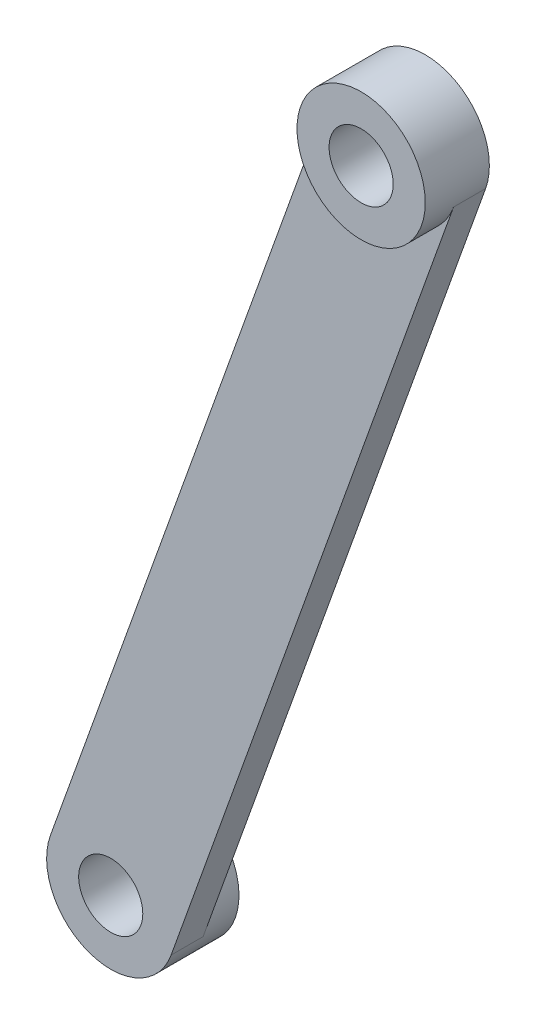
ISO-10303-21;
HEADER;
FILE_DESCRIPTION(('STEP AP214'),'2;1');
FILE_NAME('part.step','',(''),(''),'','','');
FILE_SCHEMA(('AUTOMOTIVE_DESIGN { 1 0 10303 214 1 1 1 1 }'));
ENDSEC;
DATA;
#1=APPLICATION_CONTEXT('core data for automotive mechanical design processes');
#2=APPLICATION_PROTOCOL_DEFINITION('international standard','automotive_design',2000,#1);
#3=PRODUCT_CONTEXT('',#1,'mechanical');
#4=PRODUCT('Part','Part','',(#3));
#5=PRODUCT_RELATED_PRODUCT_CATEGORY('part','',(#4));
#6=PRODUCT_DEFINITION_FORMATION('','',#4);
#7=PRODUCT_DEFINITION_CONTEXT('part definition',#1,'design');
#8=PRODUCT_DEFINITION('design','',#6,#7);
#9=PRODUCT_DEFINITION_SHAPE('','',#8);
#10=(LENGTH_UNIT() NAMED_UNIT(*) SI_UNIT(.MILLI.,.METRE.));
#11=(NAMED_UNIT(*) PLANE_ANGLE_UNIT() SI_UNIT($,.RADIAN.));
#12=(NAMED_UNIT(*) SI_UNIT($,.STERADIAN.) SOLID_ANGLE_UNIT());
#13=UNCERTAINTY_MEASURE_WITH_UNIT(LENGTH_MEASURE(1.E-05),#10,'distance_accuracy_value','');
#14=(GEOMETRIC_REPRESENTATION_CONTEXT(3) GLOBAL_UNCERTAINTY_ASSIGNED_CONTEXT((#13)) GLOBAL_UNIT_ASSIGNED_CONTEXT((#10,
#11,#12)) REPRESENTATION_CONTEXT('',''));
#15=CARTESIAN_POINT('',(0.,0.,0.));
#16=DIRECTION('',(0.,0.,1.));
#17=DIRECTION('',(1.,0.,0.));
#18=AXIS2_PLACEMENT_3D('',#15,#16,#17);
#19=CARTESIAN_POINT('',(-38.,-7.8,-3.175));
#20=DIRECTION('',(0.,0.,1.));
#21=DIRECTION('',(1.,0.,0.));
#22=AXIS2_PLACEMENT_3D('',#19,#20,#21);
#23=PLANE('',#22);
#24=CARTESIAN_POINT('',(-24.0135350971278,31.2720974548427,-3.175));
#25=DIRECTION('',(0.,0.,1.));
#26=DIRECTION('',(1.,0.,0.));
#27=AXIS2_PLACEMENT_3D('',#24,#25,#26);
#28=CIRCLE('',#27,1.5875);
#29=CARTESIAN_POINT('',(-22.4260350971278,31.2720974548427,-3.175));
#30=VERTEX_POINT('',#29);
#31=EDGE_CURVE('E140',#30,#30,#28,.T.);
#32=ORIENTED_EDGE('',*,*,#31,.T.);
#33=EDGE_LOOP('',(#32));
#34=FACE_BOUND('',#33,.T.);
#35=CARTESIAN_POINT('',(-38.,-7.8,-3.175));
#36=DIRECTION('',(0.,0.,-1.));
#37=DIRECTION('',(-1.,0.,0.));
#38=AXIS2_PLACEMENT_3D('',#35,#36,#37);
#39=CIRCLE('',#38,3.17500000000001);
#40=CARTESIAN_POINT('',(-40.9892508293765,-6.72995117911761,-3.175));
#41=VERTEX_POINT('',#40);
#42=CARTESIAN_POINT('',(-35.0107491706235,-8.8700488208824,-3.175));
#43=VERTEX_POINT('',#42);
#44=EDGE_CURVE('E75',#41,#43,#39,.T.);
#45=ORIENTED_EDGE('',*,*,#44,.F.);
#46=DIRECTION('',(-0.337023250671619,-0.941496324213077,0.));
#47=VECTOR('',#46,1.);
#48=CARTESIAN_POINT('',(-40.9892508293765,-6.72995117911761,-3.175));
#49=LINE('',#48,#47);
#50=CARTESIAN_POINT('',(-27.0027859265044,32.3421462757251,-3.175));
#51=VERTEX_POINT('',#50);
#52=EDGE_CURVE('E84',#51,#41,#49,.T.);
#53=ORIENTED_EDGE('',*,*,#52,.F.);
#54=CARTESIAN_POINT('',(-24.0135350971278,31.2720974548427,-3.175));
#55=DIRECTION('',(0.,0.,1.));
#56=DIRECTION('',(1.,0.,0.));
#57=AXIS2_PLACEMENT_3D('',#54,#55,#56);
#58=CIRCLE('',#57,3.17500000000001);
#59=CARTESIAN_POINT('',(-21.0242842677513,30.2020486339603,-3.175));
#60=VERTEX_POINT('',#59);
#61=EDGE_CURVE('E95',#60,#51,#58,.T.);
#62=ORIENTED_EDGE('',*,*,#61,.F.);
#63=DIRECTION('',(0.337023250671619,0.941496324213077,0.));
#64=VECTOR('',#63,1.);
#65=CARTESIAN_POINT('',(-35.0107491706235,-8.8700488208824,-3.175));
#66=LINE('',#65,#64);
#67=EDGE_CURVE('E85',#43,#60,#66,.T.);
#68=ORIENTED_EDGE('',*,*,#67,.F.);
#69=EDGE_LOOP('',(#45,#53,#62,#68));
#70=FACE_BOUND('',#69,.T.);
#71=ADVANCED_FACE('F35',(#34,#70),#23,.F.);
#72=CARTESIAN_POINT('',(-38.,-7.8,-3.175));
#73=DIRECTION('',(0.,0.,1.));
#74=DIRECTION('',(1.,0.,0.));
#75=AXIS2_PLACEMENT_3D('',#72,#73,#74);
#76=CYLINDRICAL_SURFACE('',#75,3.17500000000001);
#77=CARTESIAN_POINT('',(-38.,-7.8,-1.5875));
#78=DIRECTION('',(0.,0.,1.));
#79=DIRECTION('',(1.,0.,0.));
#80=AXIS2_PLACEMENT_3D('',#77,#78,#79);
#81=CIRCLE('',#80,3.17500000000001);
#82=CARTESIAN_POINT('',(-40.9892508293765,-6.72995117911761,-1.5875));
#83=VERTEX_POINT('',#82);
#84=CARTESIAN_POINT('',(-35.0107491706235,-8.8700488208824,-1.5875));
#85=VERTEX_POINT('',#84);
#86=EDGE_CURVE('E91',#83,#85,#81,.T.);
#87=ORIENTED_EDGE('',*,*,#86,.F.);
#88=DIRECTION('',(0.,0.,1.));
#89=VECTOR('',#88,1.);
#90=CARTESIAN_POINT('',(-40.9892508293765,-6.72995117911761,-3.175));
#91=LINE('',#90,#89);
#92=EDGE_CURVE('E11',#41,#83,#91,.T.);
#93=ORIENTED_EDGE('',*,*,#92,.F.);
#94=ORIENTED_EDGE('',*,*,#44,.T.);
#95=DIRECTION('',(0.,0.,1.));
#96=VECTOR('',#95,1.);
#97=CARTESIAN_POINT('',(-35.0107491706235,-8.8700488208824,-3.175));
#98=LINE('',#97,#96);
#99=EDGE_CURVE('E94',#43,#85,#98,.T.);
#100=ORIENTED_EDGE('',*,*,#99,.T.);
#101=EDGE_LOOP('',(#87,#93,#94,#100));
#102=FACE_BOUND('',#101,.T.);
#103=CARTESIAN_POINT('',(-38.,-7.8,-4.7625));
#104=DIRECTION('',(0.,0.,-1.));
#105=DIRECTION('',(-1.,0.,0.));
#106=AXIS2_PLACEMENT_3D('',#103,#104,#105);
#107=CIRCLE('',#106,3.17500000000001);
#108=CARTESIAN_POINT('',(-41.175,-7.8,-4.7625));
#109=VERTEX_POINT('',#108);
#110=EDGE_CURVE('E86',#109,#109,#107,.T.);
#111=ORIENTED_EDGE('',*,*,#110,.F.);
#112=EDGE_LOOP('',(#111));
#113=FACE_BOUND('',#112,.T.);
#114=ADVANCED_FACE('F37',(#102,#113),#76,.T.);
#115=CARTESIAN_POINT('',(-40.9892508293765,-6.72995117911761,-3.175));
#116=DIRECTION('',(-0.941496324213077,0.337023250671619,0.));
#117=DIRECTION('',(-0.337023250671619,-0.941496324213077,0.));
#118=AXIS2_PLACEMENT_3D('',#115,#116,#117);
#119=PLANE('',#118);
#120=DIRECTION('',(-0.337023250671619,-0.941496324213077,0.));
#121=VECTOR('',#120,1.);
#122=CARTESIAN_POINT('',(-40.9892508293765,-6.72995117911761,-1.5875));
#123=LINE('',#122,#121);
#124=CARTESIAN_POINT('',(-27.0027859265043,32.3421462757251,-1.5875));
#125=VERTEX_POINT('',#124);
#126=EDGE_CURVE('E104',#125,#83,#123,.T.);
#127=ORIENTED_EDGE('',*,*,#126,.F.);
#128=DIRECTION('',(0.,0.,1.));
#129=VECTOR('',#128,1.);
#130=CARTESIAN_POINT('',(-27.0027859265044,32.3421462757251,-3.175));
#131=LINE('',#130,#129);
#132=EDGE_CURVE('E45',#51,#125,#131,.T.);
#133=ORIENTED_EDGE('',*,*,#132,.F.);
#134=ORIENTED_EDGE('',*,*,#52,.T.);
#135=ORIENTED_EDGE('',*,*,#92,.T.);
#136=EDGE_LOOP('',(#127,#133,#134,#135));
#137=FACE_BOUND('',#136,.T.);
#138=ADVANCED_FACE('F93',(#137),#119,.T.);
#139=CARTESIAN_POINT('',(-24.0135350971278,31.2720974548427,-3.175));
#140=DIRECTION('',(0.,0.,1.));
#141=DIRECTION('',(1.,0.,0.));
#142=AXIS2_PLACEMENT_3D('',#139,#140,#141);
#143=CYLINDRICAL_SURFACE('',#142,3.17500000000001);
#144=ORIENTED_EDGE('',*,*,#132,.T.);
#145=CARTESIAN_POINT('',(-24.0135350971278,31.2720974548427,-1.5875));
#146=DIRECTION('',(0.,0.,1.));
#147=DIRECTION('',(1.,0.,0.));
#148=AXIS2_PLACEMENT_3D('',#145,#146,#147);
#149=CIRCLE('',#148,3.175);
#150=CARTESIAN_POINT('',(-21.0242842677513,30.2020486339603,-1.5875));
#151=VERTEX_POINT('',#150);
#152=EDGE_CURVE('E117',#125,#151,#149,.T.);
#153=ORIENTED_EDGE('',*,*,#152,.T.);
#154=DIRECTION('',(0.,0.,1.));
#155=VECTOR('',#154,1.);
#156=CARTESIAN_POINT('',(-21.0242842677513,30.2020486339603,-3.175));
#157=LINE('',#156,#155);
#158=EDGE_CURVE('E68',#60,#151,#157,.T.);
#159=ORIENTED_EDGE('',*,*,#158,.F.);
#160=ORIENTED_EDGE('',*,*,#61,.T.);
#161=EDGE_LOOP('',(#144,#153,#159,#160));
#162=FACE_BOUND('',#161,.T.);
#163=CARTESIAN_POINT('',(-24.0135350971278,31.2720974548427,0.));
#164=DIRECTION('',(0.,0.,1.));
#165=DIRECTION('',(1.,0.,0.));
#166=AXIS2_PLACEMENT_3D('',#163,#164,#165);
#167=CIRCLE('',#166,3.175);
#168=CARTESIAN_POINT('',(-20.8385350971278,31.2720974548427,0.));
#169=VERTEX_POINT('',#168);
#170=EDGE_CURVE('E118',#169,#169,#167,.T.);
#171=ORIENTED_EDGE('',*,*,#170,.F.);
#172=EDGE_LOOP('',(#171));
#173=FACE_BOUND('',#172,.T.);
#174=ADVANCED_FACE('F162',(#162,#173),#143,.T.);
#175=CARTESIAN_POINT('',(-35.0107491706235,-8.8700488208824,-3.175));
#176=DIRECTION('',(0.941496324213077,-0.337023250671619,0.));
#177=DIRECTION('',(0.337023250671619,0.941496324213077,0.));
#178=AXIS2_PLACEMENT_3D('',#175,#176,#177);
#179=PLANE('',#178);
#180=DIRECTION('',(0.337023250671619,0.941496324213077,0.));
#181=VECTOR('',#180,1.);
#182=CARTESIAN_POINT('',(-35.0107491706235,-8.8700488208824,-1.5875));
#183=LINE('',#182,#181);
#184=EDGE_CURVE('E130',#85,#151,#183,.T.);
#185=ORIENTED_EDGE('',*,*,#184,.F.);
#186=ORIENTED_EDGE('',*,*,#99,.F.);
#187=ORIENTED_EDGE('',*,*,#67,.T.);
#188=ORIENTED_EDGE('',*,*,#158,.T.);
#189=EDGE_LOOP('',(#185,#186,#187,#188));
#190=FACE_BOUND('',#189,.T.);
#191=ADVANCED_FACE('F153',(#190),#179,.T.);
#192=CARTESIAN_POINT('',(-38.,-7.8,-1.5875));
#193=DIRECTION('',(0.,0.,1.));
#194=DIRECTION('',(1.,0.,0.));
#195=AXIS2_PLACEMENT_3D('',#192,#193,#194);
#196=PLANE('',#195);
#197=ORIENTED_EDGE('',*,*,#152,.F.);
#198=ORIENTED_EDGE('',*,*,#126,.T.);
#199=ORIENTED_EDGE('',*,*,#86,.T.);
#200=ORIENTED_EDGE('',*,*,#184,.T.);
#201=EDGE_LOOP('',(#197,#198,#199,#200));
#202=FACE_BOUND('',#201,.T.);
#203=CARTESIAN_POINT('',(-38.,-7.8,-1.5875));
#204=DIRECTION('',(0.,0.,1.));
#205=DIRECTION('',(1.,0.,0.));
#206=AXIS2_PLACEMENT_3D('',#203,#204,#205);
#207=CIRCLE('',#206,1.5875);
#208=CARTESIAN_POINT('',(-36.4125,-7.8,-1.5875));
#209=VERTEX_POINT('',#208);
#210=EDGE_CURVE('E121',#209,#209,#207,.T.);
#211=ORIENTED_EDGE('',*,*,#210,.F.);
#212=EDGE_LOOP('',(#211));
#213=FACE_BOUND('',#212,.T.);
#214=ADVANCED_FACE('F150',(#202,#213),#196,.T.);
#215=CARTESIAN_POINT('',(-24.0135350971278,31.2720974548427,-3.175));
#216=DIRECTION('',(0.,0.,1.));
#217=DIRECTION('',(1.,0.,0.));
#218=AXIS2_PLACEMENT_3D('',#215,#216,#217);
#219=CYLINDRICAL_SURFACE('',#218,1.5875);
#220=ORIENTED_EDGE('',*,*,#31,.F.);
#221=EDGE_LOOP('',(#220));
#222=FACE_BOUND('',#221,.T.);
#223=CARTESIAN_POINT('',(-24.0135350971278,31.2720974548427,0.));
#224=DIRECTION('',(0.,0.,1.));
#225=DIRECTION('',(1.,0.,0.));
#226=AXIS2_PLACEMENT_3D('',#223,#224,#225);
#227=CIRCLE('',#226,1.5875);
#228=CARTESIAN_POINT('',(-22.4260350971278,31.2720974548427,0.));
#229=VERTEX_POINT('',#228);
#230=EDGE_CURVE('E114',#229,#229,#227,.T.);
#231=ORIENTED_EDGE('',*,*,#230,.T.);
#232=EDGE_LOOP('',(#231));
#233=FACE_BOUND('',#232,.T.);
#234=ADVANCED_FACE('F152',(#222,#233),#219,.F.);
#235=CARTESIAN_POINT('',(-38.,-7.8,-3.175));
#236=DIRECTION('',(0.,0.,1.));
#237=DIRECTION('',(1.,0.,0.));
#238=AXIS2_PLACEMENT_3D('',#235,#236,#237);
#239=CYLINDRICAL_SURFACE('',#238,1.5875);
#240=ORIENTED_EDGE('',*,*,#210,.T.);
#241=EDGE_LOOP('',(#240));
#242=FACE_BOUND('',#241,.T.);
#243=CARTESIAN_POINT('',(-38.,-7.8,-4.7625));
#244=DIRECTION('',(0.,0.,-1.));
#245=DIRECTION('',(-1.,0.,0.));
#246=AXIS2_PLACEMENT_3D('',#243,#244,#245);
#247=CIRCLE('',#246,1.5875);
#248=CARTESIAN_POINT('',(-39.5875,-7.8,-4.7625));
#249=VERTEX_POINT('',#248);
#250=EDGE_CURVE('E87',#249,#249,#247,.T.);
#251=ORIENTED_EDGE('',*,*,#250,.T.);
#252=EDGE_LOOP('',(#251));
#253=FACE_BOUND('',#252,.T.);
#254=ADVANCED_FACE('F147',(#242,#253),#239,.F.);
#255=CARTESIAN_POINT('',(-24.0135350971278,31.2720974548427,0.));
#256=DIRECTION('',(0.,0.,1.));
#257=DIRECTION('',(1.,0.,0.));
#258=AXIS2_PLACEMENT_3D('',#255,#256,#257);
#259=PLANE('',#258);
#260=ORIENTED_EDGE('',*,*,#170,.T.);
#261=EDGE_LOOP('',(#260));
#262=FACE_BOUND('',#261,.T.);
#263=ORIENTED_EDGE('',*,*,#230,.F.);
#264=EDGE_LOOP('',(#263));
#265=FACE_BOUND('',#264,.T.);
#266=ADVANCED_FACE('F174',(#262,#265),#259,.T.);
#267=CARTESIAN_POINT('',(-38.,-7.8,-4.7625));
#268=DIRECTION('',(0.,0.,-1.));
#269=DIRECTION('',(-1.,0.,0.));
#270=AXIS2_PLACEMENT_3D('',#267,#268,#269);
#271=PLANE('',#270);
#272=ORIENTED_EDGE('',*,*,#110,.T.);
#273=EDGE_LOOP('',(#272));
#274=FACE_BOUND('',#273,.T.);
#275=ORIENTED_EDGE('',*,*,#250,.F.);
#276=EDGE_LOOP('',(#275));
#277=FACE_BOUND('',#276,.T.);
#278=ADVANCED_FACE('F177',(#274,#277),#271,.T.);
#279=CLOSED_SHELL('',(#71,#114,#138,#174,#191,#214,#234,#254,#266,#278));
#280=MANIFOLD_SOLID_BREP('B2',#279);
#281=ADVANCED_BREP_SHAPE_REPRESENTATION('',(#18,#280),#14);
#282=SHAPE_DEFINITION_REPRESENTATION(#9,#281);
ENDSEC;
END-ISO-10303-21;
